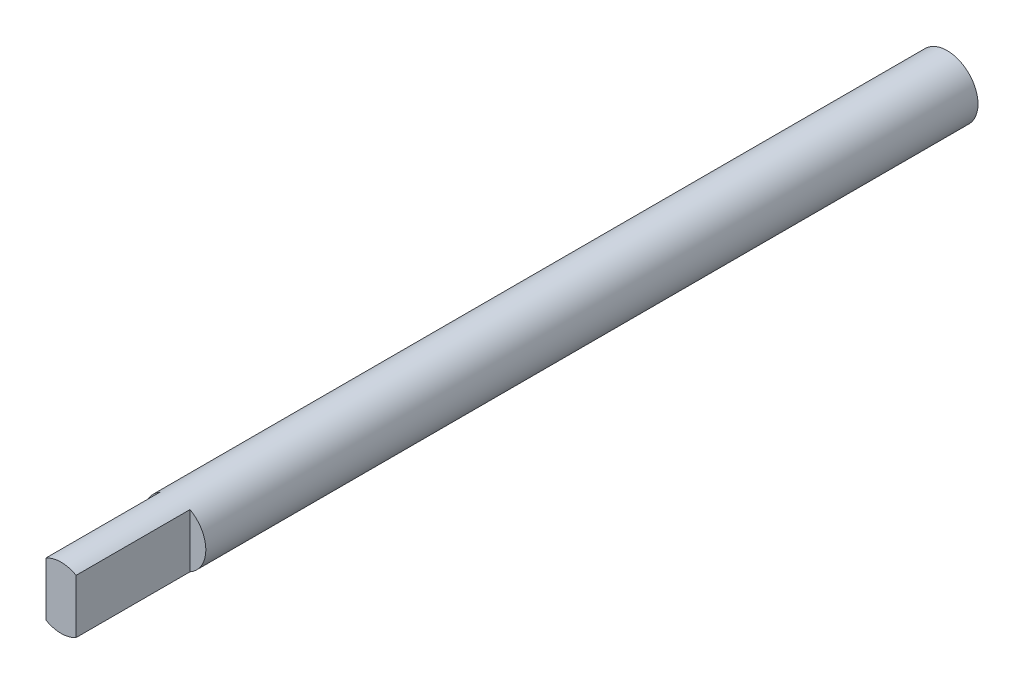
ISO-10303-21;
HEADER;
FILE_DESCRIPTION(('STEP AP214'),'2;1');
FILE_NAME('part.step','',(''),(''),'','','');
FILE_SCHEMA(('AUTOMOTIVE_DESIGN { 1 0 10303 214 1 1 1 1 }'));
ENDSEC;
DATA;
#1=APPLICATION_CONTEXT('core data for automotive mechanical design processes');
#2=APPLICATION_PROTOCOL_DEFINITION('international standard','automotive_design',2000,#1);
#3=PRODUCT_CONTEXT('',#1,'mechanical');
#4=PRODUCT('Part','Part','',(#3));
#5=PRODUCT_RELATED_PRODUCT_CATEGORY('part','',(#4));
#6=PRODUCT_DEFINITION_FORMATION('','',#4);
#7=PRODUCT_DEFINITION_CONTEXT('part definition',#1,'design');
#8=PRODUCT_DEFINITION('design','',#6,#7);
#9=PRODUCT_DEFINITION_SHAPE('','',#8);
#10=(LENGTH_UNIT() NAMED_UNIT(*) SI_UNIT(.MILLI.,.METRE.));
#11=(NAMED_UNIT(*) PLANE_ANGLE_UNIT() SI_UNIT($,.RADIAN.));
#12=(NAMED_UNIT(*) SI_UNIT($,.STERADIAN.) SOLID_ANGLE_UNIT());
#13=UNCERTAINTY_MEASURE_WITH_UNIT(LENGTH_MEASURE(1.E-05),#10,'distance_accuracy_value','');
#14=(GEOMETRIC_REPRESENTATION_CONTEXT(3) GLOBAL_UNCERTAINTY_ASSIGNED_CONTEXT((#13)) GLOBAL_UNIT_ASSIGNED_CONTEXT((#10,
#11,#12)) REPRESENTATION_CONTEXT('',''));
#15=CARTESIAN_POINT('',(0.,0.,0.));
#16=DIRECTION('',(0.,0.,1.));
#17=DIRECTION('',(1.,0.,0.));
#18=AXIS2_PLACEMENT_3D('',#15,#16,#17);
#19=CARTESIAN_POINT('',(0.,0.,-7.5));
#20=DIRECTION('',(0.,0.,1.));
#21=DIRECTION('',(1.,0.,0.));
#22=AXIS2_PLACEMENT_3D('',#19,#20,#21);
#23=PLANE('',#22);
#24=DIRECTION('',(0.,1.,0.));
#25=VECTOR('',#24,1.);
#26=CARTESIAN_POINT('',(1.95,3.49249194702006,-7.5));
#27=LINE('',#26,#25);
#28=CARTESIAN_POINT('',(1.95,-3.49249194702006,-7.5));
#29=VERTEX_POINT('',#28);
#30=CARTESIAN_POINT('',(1.95,3.49249194702006,-7.5));
#31=VERTEX_POINT('',#30);
#32=EDGE_CURVE('E58',#29,#31,#27,.T.);
#33=ORIENTED_EDGE('',*,*,#32,.F.);
#34=CARTESIAN_POINT('',(0.,0.,-7.5));
#35=DIRECTION('',(0.,0.,1.));
#36=DIRECTION('',(1.,0.,0.));
#37=AXIS2_PLACEMENT_3D('',#34,#35,#36);
#38=CIRCLE('',#37,4.);
#39=EDGE_CURVE('E47',#29,#31,#38,.T.);
#40=ORIENTED_EDGE('',*,*,#39,.T.);
#41=EDGE_LOOP('',(#33,#40));
#42=FACE_BOUND('',#41,.T.);
#43=ADVANCED_FACE('F43',(#42),#23,.T.);
#44=CARTESIAN_POINT('',(0.,0.,-107.5));
#45=DIRECTION('',(0.,0.,1.));
#46=DIRECTION('',(1.,0.,0.));
#47=AXIS2_PLACEMENT_3D('',#44,#45,#46);
#48=CYLINDRICAL_SURFACE('',#47,4.);
#49=CARTESIAN_POINT('',(0.,0.,-107.5));
#50=DIRECTION('',(0.,0.,1.));
#51=DIRECTION('',(1.,0.,0.));
#52=AXIS2_PLACEMENT_3D('',#49,#50,#51);
#53=CIRCLE('',#52,4.);
#54=CARTESIAN_POINT('',(4.,0.,-107.5));
#55=VERTEX_POINT('',#54);
#56=EDGE_CURVE('E11',#55,#55,#53,.T.);
#57=ORIENTED_EDGE('',*,*,#56,.T.);
#58=EDGE_LOOP('',(#57));
#59=FACE_BOUND('',#58,.T.);
#60=CARTESIAN_POINT('',(-1.95,3.49249194702006,-7.5));
#61=VERTEX_POINT('',#60);
#62=CARTESIAN_POINT('',(-1.95,-3.49249194702007,-7.5));
#63=VERTEX_POINT('',#62);
#64=EDGE_CURVE('E52',#61,#63,#38,.T.);
#65=ORIENTED_EDGE('',*,*,#64,.F.);
#66=DIRECTION('',(0.,0.,-1.));
#67=VECTOR('',#66,1.);
#68=CARTESIAN_POINT('',(-1.95,3.49249194702007,7.25));
#69=LINE('',#68,#67);
#70=CARTESIAN_POINT('',(-1.95,3.49249194702007,7.25));
#71=VERTEX_POINT('',#70);
#72=EDGE_CURVE('E89',#71,#61,#69,.T.);
#73=ORIENTED_EDGE('',*,*,#72,.F.);
#74=CARTESIAN_POINT('',(0.,0.,7.25));
#75=DIRECTION('',(0.,0.,1.));
#76=DIRECTION('',(1.,0.,0.));
#77=AXIS2_PLACEMENT_3D('',#74,#75,#76);
#78=CIRCLE('',#77,4.);
#79=CARTESIAN_POINT('',(1.95,3.49249194702006,7.25));
#80=VERTEX_POINT('',#79);
#81=EDGE_CURVE('E95',#80,#71,#78,.T.);
#82=ORIENTED_EDGE('',*,*,#81,.F.);
#83=DIRECTION('',(0.,0.,-1.));
#84=VECTOR('',#83,1.);
#85=CARTESIAN_POINT('',(1.95,3.49249194702006,7.25));
#86=LINE('',#85,#84);
#87=EDGE_CURVE('E111',#80,#31,#86,.T.);
#88=ORIENTED_EDGE('',*,*,#87,.T.);
#89=ORIENTED_EDGE('',*,*,#39,.F.);
#90=DIRECTION('',(0.,0.,-1.));
#91=VECTOR('',#90,1.);
#92=CARTESIAN_POINT('',(1.95,-3.49249194702007,7.25));
#93=LINE('',#92,#91);
#94=CARTESIAN_POINT('',(1.95,-3.49249194702007,7.25));
#95=VERTEX_POINT('',#94);
#96=EDGE_CURVE('E106',#95,#29,#93,.T.);
#97=ORIENTED_EDGE('',*,*,#96,.F.);
#98=CARTESIAN_POINT('',(0.,0.,7.25));
#99=DIRECTION('',(0.,0.,1.));
#100=DIRECTION('',(1.,0.,0.));
#101=AXIS2_PLACEMENT_3D('',#98,#99,#100);
#102=CIRCLE('',#101,4.);
#103=CARTESIAN_POINT('',(-1.95,-3.49249194702007,7.25));
#104=VERTEX_POINT('',#103);
#105=EDGE_CURVE('E94',#104,#95,#102,.T.);
#106=ORIENTED_EDGE('',*,*,#105,.F.);
#107=DIRECTION('',(0.,0.,-1.));
#108=VECTOR('',#107,1.);
#109=CARTESIAN_POINT('',(-1.95,-3.49249194702007,7.25));
#110=LINE('',#109,#108);
#111=EDGE_CURVE('E91',#104,#63,#110,.T.);
#112=ORIENTED_EDGE('',*,*,#111,.T.);
#113=EDGE_LOOP('',(#65,#73,#82,#88,#89,#97,#106,#112));
#114=FACE_BOUND('',#113,.T.);
#115=ADVANCED_FACE('F45',(#59,#114),#48,.T.);
#116=CARTESIAN_POINT('',(0.,0.,-107.5));
#117=DIRECTION('',(0.,0.,1.));
#118=DIRECTION('',(1.,0.,0.));
#119=AXIS2_PLACEMENT_3D('',#116,#117,#118);
#120=PLANE('',#119);
#121=ORIENTED_EDGE('',*,*,#56,.F.);
#122=EDGE_LOOP('',(#121));
#123=FACE_BOUND('',#122,.T.);
#124=ADVANCED_FACE('F135',(#123),#120,.F.);
#125=DIRECTION('',(0.,-1.,0.));
#126=VECTOR('',#125,1.);
#127=CARTESIAN_POINT('',(-1.95,3.49249194702007,-7.5));
#128=LINE('',#127,#126);
#129=EDGE_CURVE('E65',#61,#63,#128,.T.);
#130=ORIENTED_EDGE('',*,*,#129,.F.);
#131=ORIENTED_EDGE('',*,*,#64,.T.);
#132=EDGE_LOOP('',(#130,#131));
#133=FACE_BOUND('',#132,.T.);
#134=ADVANCED_FACE('F127',(#133),#23,.T.);
#135=CARTESIAN_POINT('',(-1.95,3.49249194702007,7.25));
#136=DIRECTION('',(1.,0.,0.));
#137=DIRECTION('',(0.,0.,-1.));
#138=AXIS2_PLACEMENT_3D('',#135,#136,#137);
#139=PLANE('',#138);
#140=ORIENTED_EDGE('',*,*,#129,.T.);
#141=ORIENTED_EDGE('',*,*,#111,.F.);
#142=DIRECTION('',(0.,-1.,0.));
#143=VECTOR('',#142,1.);
#144=CARTESIAN_POINT('',(-1.95,3.49249194702007,7.25));
#145=LINE('',#144,#143);
#146=EDGE_CURVE('E85',#71,#104,#145,.T.);
#147=ORIENTED_EDGE('',*,*,#146,.F.);
#148=ORIENTED_EDGE('',*,*,#72,.T.);
#149=EDGE_LOOP('',(#140,#141,#147,#148));
#150=FACE_BOUND('',#149,.T.);
#151=ADVANCED_FACE('F87',(#150),#139,.F.);
#152=CARTESIAN_POINT('',(1.95,3.49249194702006,7.25));
#153=DIRECTION('',(-1.,0.,0.));
#154=DIRECTION('',(0.,0.,1.));
#155=AXIS2_PLACEMENT_3D('',#152,#153,#154);
#156=PLANE('',#155);
#157=ORIENTED_EDGE('',*,*,#32,.T.);
#158=ORIENTED_EDGE('',*,*,#87,.F.);
#159=DIRECTION('',(0.,1.,0.));
#160=VECTOR('',#159,1.);
#161=CARTESIAN_POINT('',(1.95,3.49249194702006,7.25));
#162=LINE('',#161,#160);
#163=EDGE_CURVE('E100',#95,#80,#162,.T.);
#164=ORIENTED_EDGE('',*,*,#163,.F.);
#165=ORIENTED_EDGE('',*,*,#96,.T.);
#166=EDGE_LOOP('',(#157,#158,#164,#165));
#167=FACE_BOUND('',#166,.T.);
#168=ADVANCED_FACE('F118',(#167),#156,.F.);
#169=CARTESIAN_POINT('',(0.,0.,7.25));
#170=DIRECTION('',(0.,0.,1.));
#171=DIRECTION('',(1.,0.,0.));
#172=AXIS2_PLACEMENT_3D('',#169,#170,#171);
#173=PLANE('',#172);
#174=ORIENTED_EDGE('',*,*,#81,.T.);
#175=ORIENTED_EDGE('',*,*,#146,.T.);
#176=ORIENTED_EDGE('',*,*,#105,.T.);
#177=ORIENTED_EDGE('',*,*,#163,.T.);
#178=EDGE_LOOP('',(#174,#175,#176,#177));
#179=FACE_BOUND('',#178,.T.);
#180=ADVANCED_FACE('F98',(#179),#173,.T.);
#181=CLOSED_SHELL('',(#43,#115,#124,#134,#151,#168,#180));
#182=MANIFOLD_SOLID_BREP('B2',#181);
#183=ADVANCED_BREP_SHAPE_REPRESENTATION('',(#18,#182),#14);
#184=SHAPE_DEFINITION_REPRESENTATION(#9,#183);
ENDSEC;
END-ISO-10303-21;
